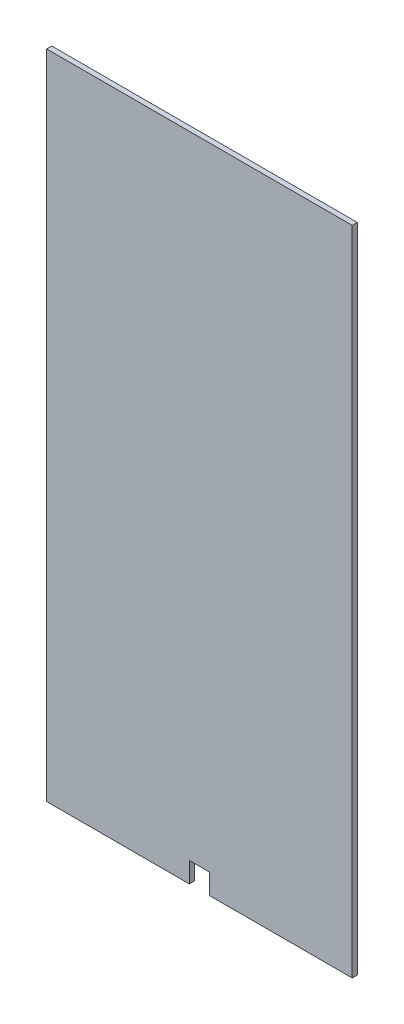
ISO-10303-21;
HEADER;
FILE_DESCRIPTION(('STEP AP214'),'2;1');
FILE_NAME('part.step','',(''),(''),'','','');
FILE_SCHEMA(('AUTOMOTIVE_DESIGN { 1 0 10303 214 1 1 1 1 }'));
ENDSEC;
DATA;
#1=APPLICATION_CONTEXT('core data for automotive mechanical design processes');
#2=APPLICATION_PROTOCOL_DEFINITION('international standard','automotive_design',2000,#1);
#3=PRODUCT_CONTEXT('',#1,'mechanical');
#4=PRODUCT('Part','Part','',(#3));
#5=PRODUCT_RELATED_PRODUCT_CATEGORY('part','',(#4));
#6=PRODUCT_DEFINITION_FORMATION('','',#4);
#7=PRODUCT_DEFINITION_CONTEXT('part definition',#1,'design');
#8=PRODUCT_DEFINITION('design','',#6,#7);
#9=PRODUCT_DEFINITION_SHAPE('','',#8);
#10=(LENGTH_UNIT() NAMED_UNIT(*) SI_UNIT(.MILLI.,.METRE.));
#11=(NAMED_UNIT(*) PLANE_ANGLE_UNIT() SI_UNIT($,.RADIAN.));
#12=(NAMED_UNIT(*) SI_UNIT($,.STERADIAN.) SOLID_ANGLE_UNIT());
#13=UNCERTAINTY_MEASURE_WITH_UNIT(LENGTH_MEASURE(1.E-05),#10,'distance_accuracy_value','');
#14=(GEOMETRIC_REPRESENTATION_CONTEXT(3) GLOBAL_UNCERTAINTY_ASSIGNED_CONTEXT((#13)) GLOBAL_UNIT_ASSIGNED_CONTEXT((#10,
#11,#12)) REPRESENTATION_CONTEXT('',''));
#15=CARTESIAN_POINT('',(0.,0.,0.));
#16=DIRECTION('',(0.,0.,1.));
#17=DIRECTION('',(1.,0.,0.));
#18=AXIS2_PLACEMENT_3D('',#15,#16,#17);
#19=CARTESIAN_POINT('',(-19.9999999999999,40.,10.));
#20=DIRECTION('',(-1.,0.,0.));
#21=DIRECTION('',(0.,-1.,0.));
#22=AXIS2_PLACEMENT_3D('',#19,#20,#21);
#23=PLANE('',#22);
#24=DIRECTION('',(0.,1.,0.));
#25=VECTOR('',#24,1.);
#26=CARTESIAN_POINT('',(-19.9999999999999,40.,0.));
#27=LINE('',#26,#25);
#28=CARTESIAN_POINT('',(-19.9999999999999,0.,0.));
#29=VERTEX_POINT('',#28);
#30=CARTESIAN_POINT('',(-19.9999999999999,40.,0.));
#31=VERTEX_POINT('',#30);
#32=EDGE_CURVE('E128',#29,#31,#27,.T.);
#33=ORIENTED_EDGE('',*,*,#32,.T.);
#34=DIRECTION('',(0.,0.,-1.));
#35=VECTOR('',#34,1.);
#36=CARTESIAN_POINT('',(-19.9999999999999,40.,10.));
#37=LINE('',#36,#35);
#38=CARTESIAN_POINT('',(-19.9999999999999,40.,10.));
#39=VERTEX_POINT('',#38);
#40=EDGE_CURVE('E11',#39,#31,#37,.T.);
#41=ORIENTED_EDGE('',*,*,#40,.F.);
#42=DIRECTION('',(0.,1.,0.));
#43=VECTOR('',#42,1.);
#44=CARTESIAN_POINT('',(-19.9999999999999,40.,10.));
#45=LINE('',#44,#43);
#46=CARTESIAN_POINT('',(-19.9999999999999,0.,10.));
#47=VERTEX_POINT('',#46);
#48=EDGE_CURVE('E142',#47,#39,#45,.T.);
#49=ORIENTED_EDGE('',*,*,#48,.F.);
#50=DIRECTION('',(0.,0.,-1.));
#51=VECTOR('',#50,1.);
#52=CARTESIAN_POINT('',(-19.9999999999999,0.,10.));
#53=LINE('',#52,#51);
#54=EDGE_CURVE('E124',#47,#29,#53,.T.);
#55=ORIENTED_EDGE('',*,*,#54,.T.);
#56=EDGE_LOOP('',(#33,#41,#49,#55));
#57=FACE_BOUND('',#56,.T.);
#58=ADVANCED_FACE('F32',(#57),#23,.F.);
#59=CARTESIAN_POINT('',(20.0000000000001,40.,10.));
#60=DIRECTION('',(0.,1.,0.));
#61=DIRECTION('',(-1.,0.,0.));
#62=AXIS2_PLACEMENT_3D('',#59,#60,#61);
#63=PLANE('',#62);
#64=DIRECTION('',(1.,0.,0.));
#65=VECTOR('',#64,1.);
#66=CARTESIAN_POINT('',(20.0000000000001,40.,0.));
#67=LINE('',#66,#65);
#68=CARTESIAN_POINT('',(20.0000000000001,40.,0.));
#69=VERTEX_POINT('',#68);
#70=EDGE_CURVE('E131',#31,#69,#67,.T.);
#71=ORIENTED_EDGE('',*,*,#70,.T.);
#72=DIRECTION('',(0.,0.,-1.));
#73=VECTOR('',#72,1.);
#74=CARTESIAN_POINT('',(20.0000000000001,40.,10.));
#75=LINE('',#74,#73);
#76=CARTESIAN_POINT('',(20.0000000000001,40.,10.));
#77=VERTEX_POINT('',#76);
#78=EDGE_CURVE('E40',#77,#69,#75,.T.);
#79=ORIENTED_EDGE('',*,*,#78,.F.);
#80=DIRECTION('',(1.,0.,0.));
#81=VECTOR('',#80,1.);
#82=CARTESIAN_POINT('',(20.0000000000001,40.,10.));
#83=LINE('',#82,#81);
#84=EDGE_CURVE('E91',#39,#77,#83,.T.);
#85=ORIENTED_EDGE('',*,*,#84,.F.);
#86=ORIENTED_EDGE('',*,*,#40,.T.);
#87=EDGE_LOOP('',(#71,#79,#85,#86));
#88=FACE_BOUND('',#87,.T.);
#89=ADVANCED_FACE('F177',(#88),#63,.F.);
#90=CARTESIAN_POINT('',(20.0000000000001,40.,10.));
#91=DIRECTION('',(1.,0.,0.));
#92=DIRECTION('',(0.,1.,0.));
#93=AXIS2_PLACEMENT_3D('',#90,#91,#92);
#94=PLANE('',#93);
#95=DIRECTION('',(0.,-1.,0.));
#96=VECTOR('',#95,1.);
#97=CARTESIAN_POINT('',(20.0000000000001,40.,0.));
#98=LINE('',#97,#96);
#99=CARTESIAN_POINT('',(20.0000000000001,0.,0.));
#100=VERTEX_POINT('',#99);
#101=EDGE_CURVE('E133',#69,#100,#98,.T.);
#102=ORIENTED_EDGE('',*,*,#101,.T.);
#103=DIRECTION('',(0.,0.,-1.));
#104=VECTOR('',#103,1.);
#105=CARTESIAN_POINT('',(20.0000000000001,0.,10.));
#106=LINE('',#105,#104);
#107=CARTESIAN_POINT('',(20.0000000000001,0.,10.));
#108=VERTEX_POINT('',#107);
#109=EDGE_CURVE('E149',#108,#100,#106,.T.);
#110=ORIENTED_EDGE('',*,*,#109,.F.);
#111=DIRECTION('',(0.,-1.,0.));
#112=VECTOR('',#111,1.);
#113=CARTESIAN_POINT('',(20.0000000000001,40.,10.));
#114=LINE('',#113,#112);
#115=EDGE_CURVE('E157',#77,#108,#114,.T.);
#116=ORIENTED_EDGE('',*,*,#115,.F.);
#117=ORIENTED_EDGE('',*,*,#78,.T.);
#118=EDGE_LOOP('',(#102,#110,#116,#117));
#119=FACE_BOUND('',#118,.T.);
#120=ADVANCED_FACE('F155',(#119),#94,.F.);
#121=CARTESIAN_POINT('',(20.0000000000001,0.,10.));
#122=DIRECTION('',(0.,1.,0.));
#123=DIRECTION('',(-1.,0.,0.));
#124=AXIS2_PLACEMENT_3D('',#121,#122,#123);
#125=PLANE('',#124);
#126=DIRECTION('',(1.,0.,0.));
#127=VECTOR('',#126,1.);
#128=CARTESIAN_POINT('',(20.0000000000001,0.,0.));
#129=LINE('',#128,#127);
#130=CARTESIAN_POINT('',(300.,0.,0.));
#131=VERTEX_POINT('',#130);
#132=EDGE_CURVE('E135',#100,#131,#129,.T.);
#133=ORIENTED_EDGE('',*,*,#132,.T.);
#134=DIRECTION('',(0.,0.,-1.));
#135=VECTOR('',#134,1.);
#136=CARTESIAN_POINT('',(300.,0.,10.));
#137=LINE('',#136,#135);
#138=CARTESIAN_POINT('',(300.,0.,10.));
#139=VERTEX_POINT('',#138);
#140=EDGE_CURVE('E146',#139,#131,#137,.T.);
#141=ORIENTED_EDGE('',*,*,#140,.F.);
#142=DIRECTION('',(1.,0.,0.));
#143=VECTOR('',#142,1.);
#144=CARTESIAN_POINT('',(20.0000000000001,0.,10.));
#145=LINE('',#144,#143);
#146=EDGE_CURVE('E169',#108,#139,#145,.T.);
#147=ORIENTED_EDGE('',*,*,#146,.F.);
#148=ORIENTED_EDGE('',*,*,#109,.T.);
#149=EDGE_LOOP('',(#133,#141,#147,#148));
#150=FACE_BOUND('',#149,.T.);
#151=ADVANCED_FACE('F165',(#150),#125,.F.);
#152=CARTESIAN_POINT('',(300.,0.,10.));
#153=DIRECTION('',(-1.,0.,0.));
#154=DIRECTION('',(0.,0.,1.));
#155=AXIS2_PLACEMENT_3D('',#152,#153,#154);
#156=PLANE('',#155);
#157=DIRECTION('',(0.,1.,0.));
#158=VECTOR('',#157,1.);
#159=CARTESIAN_POINT('',(300.,0.,0.));
#160=LINE('',#159,#158);
#161=CARTESIAN_POINT('',(300.,1280.,0.));
#162=VERTEX_POINT('',#161);
#163=EDGE_CURVE('E137',#131,#162,#160,.T.);
#164=ORIENTED_EDGE('',*,*,#163,.T.);
#165=DIRECTION('',(0.,0.,-1.));
#166=VECTOR('',#165,1.);
#167=CARTESIAN_POINT('',(300.,1280.,10.));
#168=LINE('',#167,#166);
#169=CARTESIAN_POINT('',(300.,1280.,10.));
#170=VERTEX_POINT('',#169);
#171=EDGE_CURVE('E119',#170,#162,#168,.T.);
#172=ORIENTED_EDGE('',*,*,#171,.F.);
#173=DIRECTION('',(0.,1.,0.));
#174=VECTOR('',#173,1.);
#175=CARTESIAN_POINT('',(300.,0.,10.));
#176=LINE('',#175,#174);
#177=EDGE_CURVE('E110',#139,#170,#176,.T.);
#178=ORIENTED_EDGE('',*,*,#177,.F.);
#179=ORIENTED_EDGE('',*,*,#140,.T.);
#180=EDGE_LOOP('',(#164,#172,#178,#179));
#181=FACE_BOUND('',#180,.T.);
#182=ADVANCED_FACE('F168',(#181),#156,.F.);
#183=CARTESIAN_POINT('',(-300.,1280.,10.));
#184=DIRECTION('',(0.,-1.,0.));
#185=DIRECTION('',(1.,0.,0.));
#186=AXIS2_PLACEMENT_3D('',#183,#184,#185);
#187=PLANE('',#186);
#188=DIRECTION('',(-1.,0.,0.));
#189=VECTOR('',#188,1.);
#190=CARTESIAN_POINT('',(-300.,1280.,0.));
#191=LINE('',#190,#189);
#192=CARTESIAN_POINT('',(-300.,1280.,0.));
#193=VERTEX_POINT('',#192);
#194=EDGE_CURVE('E118',#162,#193,#191,.T.);
#195=ORIENTED_EDGE('',*,*,#194,.T.);
#196=DIRECTION('',(0.,0.,-1.));
#197=VECTOR('',#196,1.);
#198=CARTESIAN_POINT('',(-300.,1280.,10.));
#199=LINE('',#198,#197);
#200=CARTESIAN_POINT('',(-300.,1280.,10.));
#201=VERTEX_POINT('',#200);
#202=EDGE_CURVE('E115',#201,#193,#199,.T.);
#203=ORIENTED_EDGE('',*,*,#202,.F.);
#204=DIRECTION('',(-1.,0.,0.));
#205=VECTOR('',#204,1.);
#206=CARTESIAN_POINT('',(-300.,1280.,10.));
#207=LINE('',#206,#205);
#208=EDGE_CURVE('E104',#170,#201,#207,.T.);
#209=ORIENTED_EDGE('',*,*,#208,.F.);
#210=ORIENTED_EDGE('',*,*,#171,.T.);
#211=EDGE_LOOP('',(#195,#203,#209,#210));
#212=FACE_BOUND('',#211,.T.);
#213=ADVANCED_FACE('F116',(#212),#187,.F.);
#214=CARTESIAN_POINT('',(-300.,0.,10.));
#215=DIRECTION('',(1.,0.,0.));
#216=DIRECTION('',(0.,0.,-1.));
#217=AXIS2_PLACEMENT_3D('',#214,#215,#216);
#218=PLANE('',#217);
#219=DIRECTION('',(0.,-1.,0.));
#220=VECTOR('',#219,1.);
#221=CARTESIAN_POINT('',(-300.,0.,0.));
#222=LINE('',#221,#220);
#223=CARTESIAN_POINT('',(-300.,0.,0.));
#224=VERTEX_POINT('',#223);
#225=EDGE_CURVE('E77',#193,#224,#222,.T.);
#226=ORIENTED_EDGE('',*,*,#225,.T.);
#227=DIRECTION('',(0.,0.,-1.));
#228=VECTOR('',#227,1.);
#229=CARTESIAN_POINT('',(-300.,0.,10.));
#230=LINE('',#229,#228);
#231=CARTESIAN_POINT('',(-300.,0.,10.));
#232=VERTEX_POINT('',#231);
#233=EDGE_CURVE('E120',#232,#224,#230,.T.);
#234=ORIENTED_EDGE('',*,*,#233,.F.);
#235=DIRECTION('',(0.,-1.,0.));
#236=VECTOR('',#235,1.);
#237=CARTESIAN_POINT('',(-300.,0.,10.));
#238=LINE('',#237,#236);
#239=EDGE_CURVE('E108',#201,#232,#238,.T.);
#240=ORIENTED_EDGE('',*,*,#239,.F.);
#241=ORIENTED_EDGE('',*,*,#202,.T.);
#242=EDGE_LOOP('',(#226,#234,#240,#241));
#243=FACE_BOUND('',#242,.T.);
#244=ADVANCED_FACE('F122',(#243),#218,.F.);
#245=CARTESIAN_POINT('',(-19.9999999999999,0.,10.));
#246=DIRECTION('',(0.,1.,0.));
#247=DIRECTION('',(-1.,0.,0.));
#248=AXIS2_PLACEMENT_3D('',#245,#246,#247);
#249=PLANE('',#248);
#250=DIRECTION('',(1.,0.,0.));
#251=VECTOR('',#250,1.);
#252=CARTESIAN_POINT('',(-19.9999999999999,0.,0.));
#253=LINE('',#252,#251);
#254=EDGE_CURVE('E83',#224,#29,#253,.T.);
#255=ORIENTED_EDGE('',*,*,#254,.T.);
#256=ORIENTED_EDGE('',*,*,#54,.F.);
#257=DIRECTION('',(1.,0.,0.));
#258=VECTOR('',#257,1.);
#259=CARTESIAN_POINT('',(-19.9999999999999,0.,10.));
#260=LINE('',#259,#258);
#261=EDGE_CURVE('E48',#232,#47,#260,.T.);
#262=ORIENTED_EDGE('',*,*,#261,.F.);
#263=ORIENTED_EDGE('',*,*,#233,.T.);
#264=EDGE_LOOP('',(#255,#256,#262,#263));
#265=FACE_BOUND('',#264,.T.);
#266=ADVANCED_FACE('F193',(#265),#249,.F.);
#267=CARTESIAN_POINT('',(0.,0.,10.));
#268=DIRECTION('',(0.,0.,-1.));
#269=DIRECTION('',(-1.,0.,0.));
#270=AXIS2_PLACEMENT_3D('',#267,#268,#269);
#271=PLANE('',#270);
#272=ORIENTED_EDGE('',*,*,#48,.T.);
#273=ORIENTED_EDGE('',*,*,#84,.T.);
#274=ORIENTED_EDGE('',*,*,#115,.T.);
#275=ORIENTED_EDGE('',*,*,#146,.T.);
#276=ORIENTED_EDGE('',*,*,#177,.T.);
#277=ORIENTED_EDGE('',*,*,#208,.T.);
#278=ORIENTED_EDGE('',*,*,#239,.T.);
#279=ORIENTED_EDGE('',*,*,#261,.T.);
#280=EDGE_LOOP('',(#272,#273,#274,#275,#276,#277,#278,#279));
#281=FACE_BOUND('',#280,.T.);
#282=ADVANCED_FACE('F106',(#281),#271,.F.);
#283=CARTESIAN_POINT('',(0.,0.,0.));
#284=DIRECTION('',(0.,0.,-1.));
#285=DIRECTION('',(-1.,0.,0.));
#286=AXIS2_PLACEMENT_3D('',#283,#284,#285);
#287=PLANE('',#286);
#288=ORIENTED_EDGE('',*,*,#32,.F.);
#289=ORIENTED_EDGE('',*,*,#254,.F.);
#290=ORIENTED_EDGE('',*,*,#225,.F.);
#291=ORIENTED_EDGE('',*,*,#194,.F.);
#292=ORIENTED_EDGE('',*,*,#163,.F.);
#293=ORIENTED_EDGE('',*,*,#132,.F.);
#294=ORIENTED_EDGE('',*,*,#101,.F.);
#295=ORIENTED_EDGE('',*,*,#70,.F.);
#296=EDGE_LOOP('',(#288,#289,#290,#291,#292,#293,#294,#295));
#297=FACE_BOUND('',#296,.T.);
#298=ADVANCED_FACE('F161',(#297),#287,.T.);
#299=CLOSED_SHELL('',(#58,#89,#120,#151,#182,#213,#244,#266,#282,#298));
#300=MANIFOLD_SOLID_BREP('B2',#299);
#301=ADVANCED_BREP_SHAPE_REPRESENTATION('',(#18,#300),#14);
#302=SHAPE_DEFINITION_REPRESENTATION(#9,#301);
ENDSEC;
END-ISO-10303-21;
